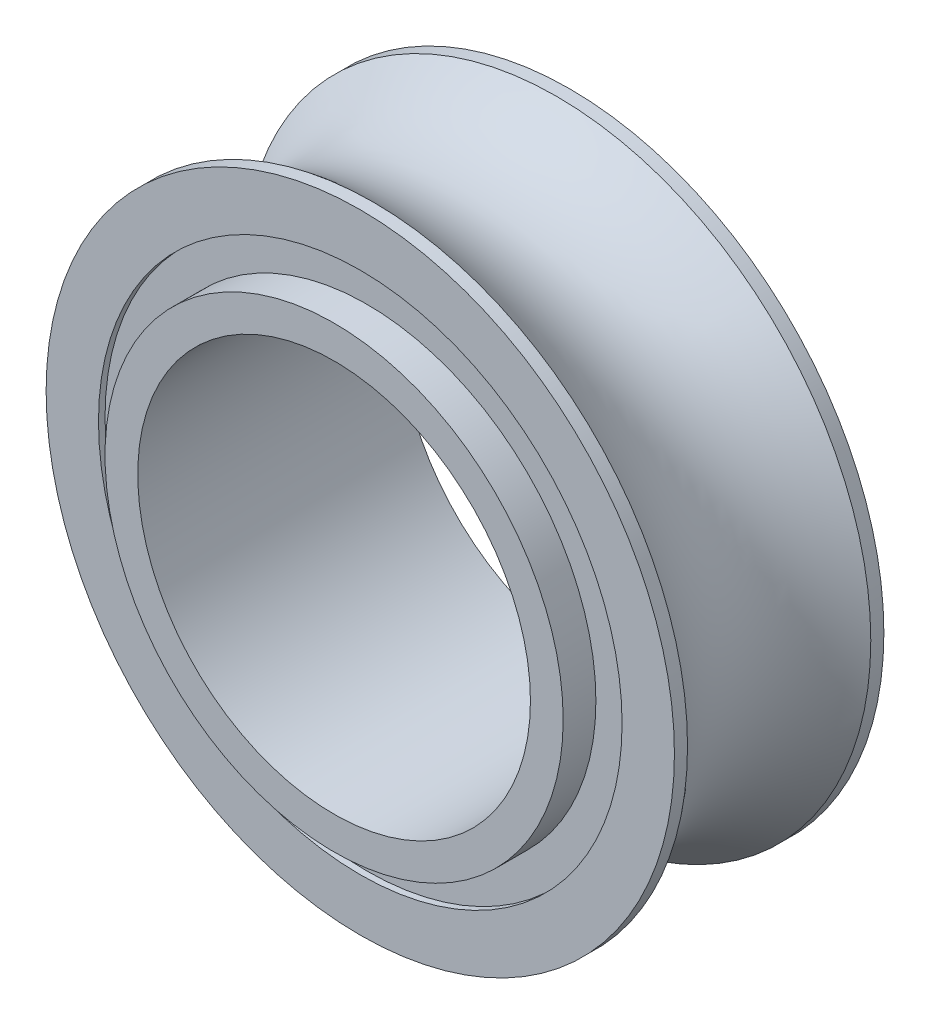
ISO-10303-21;
HEADER;
FILE_DESCRIPTION(('STEP AP214'),'2;1');
FILE_NAME('part.step','',(''),(''),'','','');
FILE_SCHEMA(('AUTOMOTIVE_DESIGN { 1 0 10303 214 1 1 1 1 }'));
ENDSEC;
DATA;
#1=APPLICATION_CONTEXT('core data for automotive mechanical design processes');
#2=APPLICATION_PROTOCOL_DEFINITION('international standard','automotive_design',2000,#1);
#3=PRODUCT_CONTEXT('',#1,'mechanical');
#4=PRODUCT('Part','Part','',(#3));
#5=PRODUCT_RELATED_PRODUCT_CATEGORY('part','',(#4));
#6=PRODUCT_DEFINITION_FORMATION('','',#4);
#7=PRODUCT_DEFINITION_CONTEXT('part definition',#1,'design');
#8=PRODUCT_DEFINITION('design','',#6,#7);
#9=PRODUCT_DEFINITION_SHAPE('','',#8);
#10=(LENGTH_UNIT() NAMED_UNIT(*) SI_UNIT(.MILLI.,.METRE.));
#11=(NAMED_UNIT(*) PLANE_ANGLE_UNIT() SI_UNIT($,.RADIAN.));
#12=(NAMED_UNIT(*) SI_UNIT($,.STERADIAN.) SOLID_ANGLE_UNIT());
#13=UNCERTAINTY_MEASURE_WITH_UNIT(LENGTH_MEASURE(1.E-05),#10,'distance_accuracy_value','');
#14=(GEOMETRIC_REPRESENTATION_CONTEXT(3) GLOBAL_UNCERTAINTY_ASSIGNED_CONTEXT((#13)) GLOBAL_UNIT_ASSIGNED_CONTEXT((#10,
#11,#12)) REPRESENTATION_CONTEXT('',''));
#15=CARTESIAN_POINT('',(0.,0.,0.));
#16=DIRECTION('',(0.,0.,1.));
#17=DIRECTION('',(1.,0.,0.));
#18=AXIS2_PLACEMENT_3D('',#15,#16,#17);
#19=CARTESIAN_POINT('',(0.,0.,10.16));
#20=DIRECTION('',(0.,0.,-1.));
#21=DIRECTION('',(-1.,0.,0.));
#22=AXIS2_PLACEMENT_3D('',#19,#20,#21);
#23=CYLINDRICAL_SURFACE('',#22,30.48);
#24=CARTESIAN_POINT('',(0.,0.,10.16));
#25=DIRECTION('',(0.,0.,1.));
#26=DIRECTION('',(1.,0.,0.));
#27=AXIS2_PLACEMENT_3D('',#24,#25,#26);
#28=CIRCLE('',#27,30.48);
#29=CARTESIAN_POINT('',(30.48,0.,10.16));
#30=VERTEX_POINT('',#29);
#31=EDGE_CURVE('E70',#30,#30,#28,.T.);
#32=ORIENTED_EDGE('',*,*,#31,.F.);
#33=EDGE_LOOP('',(#32));
#34=FACE_BOUND('',#33,.T.);
#35=CARTESIAN_POINT('',(0.,0.,8.89));
#36=DIRECTION('',(0.,0.,1.));
#37=DIRECTION('',(1.,0.,0.));
#38=AXIS2_PLACEMENT_3D('',#35,#36,#37);
#39=CIRCLE('',#38,30.48);
#40=CARTESIAN_POINT('',(30.48,0.,8.89));
#41=VERTEX_POINT('',#40);
#42=EDGE_CURVE('E80',#41,#41,#39,.T.);
#43=ORIENTED_EDGE('',*,*,#42,.T.);
#44=EDGE_LOOP('',(#43));
#45=FACE_BOUND('',#44,.T.);
#46=ADVANCED_FACE('F38',(#34,#45),#23,.T.);
#47=CARTESIAN_POINT('',(0.,0.,-10.16));
#48=DIRECTION('',(0.,0.,1.));
#49=DIRECTION('',(1.,0.,0.));
#50=AXIS2_PLACEMENT_3D('',#47,#48,#49);
#51=CIRCLE('',#50,30.48);
#52=CARTESIAN_POINT('',(30.48,0.,-10.16));
#53=VERTEX_POINT('',#52);
#54=EDGE_CURVE('E71',#53,#53,#51,.T.);
#55=ORIENTED_EDGE('',*,*,#54,.T.);
#56=EDGE_LOOP('',(#55));
#57=FACE_BOUND('',#56,.T.);
#58=CARTESIAN_POINT('',(0.,0.,-8.89));
#59=DIRECTION('',(0.,0.,1.));
#60=DIRECTION('',(1.,0.,0.));
#61=AXIS2_PLACEMENT_3D('',#58,#59,#60);
#62=CIRCLE('',#61,30.48);
#63=CARTESIAN_POINT('',(30.48,0.,-8.89));
#64=VERTEX_POINT('',#63);
#65=EDGE_CURVE('E85',#64,#64,#62,.T.);
#66=ORIENTED_EDGE('',*,*,#65,.F.);
#67=EDGE_LOOP('',(#66));
#68=FACE_BOUND('',#67,.T.);
#69=ADVANCED_FACE('F114',(#57,#68),#23,.T.);
#70=CARTESIAN_POINT('',(0.,0.,12.7));
#71=DIRECTION('',(0.,0.,-1.));
#72=DIRECTION('',(-1.,0.,0.));
#73=AXIS2_PLACEMENT_3D('',#70,#71,#72);
#74=CYLINDRICAL_SURFACE('',#73,22.225);
#75=CARTESIAN_POINT('',(0.,0.,-12.7));
#76=DIRECTION('',(0.,0.,1.));
#77=DIRECTION('',(1.,0.,0.));
#78=AXIS2_PLACEMENT_3D('',#75,#76,#77);
#79=CIRCLE('',#78,22.225);
#80=CARTESIAN_POINT('',(22.225,0.,-12.7));
#81=VERTEX_POINT('',#80);
#82=EDGE_CURVE('E49',#81,#81,#79,.T.);
#83=ORIENTED_EDGE('',*,*,#82,.T.);
#84=EDGE_LOOP('',(#83));
#85=FACE_BOUND('',#84,.T.);
#86=CARTESIAN_POINT('',(0.,0.,-9.525));
#87=DIRECTION('',(0.,0.,1.));
#88=DIRECTION('',(1.,0.,0.));
#89=AXIS2_PLACEMENT_3D('',#86,#87,#88);
#90=CIRCLE('',#89,22.225);
#91=CARTESIAN_POINT('',(22.225,0.,-9.525));
#92=VERTEX_POINT('',#91);
#93=EDGE_CURVE('E10',#92,#92,#90,.T.);
#94=ORIENTED_EDGE('',*,*,#93,.F.);
#95=EDGE_LOOP('',(#94));
#96=FACE_BOUND('',#95,.T.);
#97=ADVANCED_FACE('F131',(#85,#96),#74,.T.);
#98=CARTESIAN_POINT('',(0.,0.,12.7));
#99=DIRECTION('',(0.,0.,1.));
#100=DIRECTION('',(1.,0.,0.));
#101=AXIS2_PLACEMENT_3D('',#98,#99,#100);
#102=PLANE('',#101);
#103=CARTESIAN_POINT('',(0.,0.,12.7));
#104=DIRECTION('',(0.,0.,1.));
#105=DIRECTION('',(1.,0.,0.));
#106=AXIS2_PLACEMENT_3D('',#103,#104,#105);
#107=CIRCLE('',#106,22.225);
#108=CARTESIAN_POINT('',(22.225,0.,12.7));
#109=VERTEX_POINT('',#108);
#110=EDGE_CURVE('E45',#109,#109,#107,.T.);
#111=ORIENTED_EDGE('',*,*,#110,.T.);
#112=EDGE_LOOP('',(#111));
#113=FACE_BOUND('',#112,.T.);
#114=CARTESIAN_POINT('',(0.,0.,12.7));
#115=DIRECTION('',(0.,0.,1.));
#116=DIRECTION('',(1.,0.,0.));
#117=AXIS2_PLACEMENT_3D('',#114,#115,#116);
#118=CIRCLE('',#117,19.05);
#119=CARTESIAN_POINT('',(19.05,0.,12.7));
#120=VERTEX_POINT('',#119);
#121=EDGE_CURVE('E54',#120,#120,#118,.T.);
#122=ORIENTED_EDGE('',*,*,#121,.F.);
#123=EDGE_LOOP('',(#122));
#124=FACE_BOUND('',#123,.T.);
#125=ADVANCED_FACE('F128',(#113,#124),#102,.T.);
#126=CARTESIAN_POINT('',(0.,0.,-12.7));
#127=DIRECTION('',(0.,0.,1.));
#128=DIRECTION('',(1.,0.,0.));
#129=AXIS2_PLACEMENT_3D('',#126,#127,#128);
#130=PLANE('',#129);
#131=ORIENTED_EDGE('',*,*,#82,.F.);
#132=EDGE_LOOP('',(#131));
#133=FACE_BOUND('',#132,.T.);
#134=CARTESIAN_POINT('',(0.,0.,-12.7));
#135=DIRECTION('',(0.,0.,1.));
#136=DIRECTION('',(1.,0.,0.));
#137=AXIS2_PLACEMENT_3D('',#134,#135,#136);
#138=CIRCLE('',#137,19.05);
#139=CARTESIAN_POINT('',(19.05,0.,-12.7));
#140=VERTEX_POINT('',#139);
#141=EDGE_CURVE('E56',#140,#140,#138,.T.);
#142=ORIENTED_EDGE('',*,*,#141,.T.);
#143=EDGE_LOOP('',(#142));
#144=FACE_BOUND('',#143,.T.);
#145=ADVANCED_FACE('F130',(#133,#144),#130,.F.);
#146=CARTESIAN_POINT('',(0.,0.,9.525));
#147=DIRECTION('',(0.,0.,1.));
#148=DIRECTION('',(1.,0.,0.));
#149=AXIS2_PLACEMENT_3D('',#146,#147,#148);
#150=CIRCLE('',#149,22.225);
#151=CARTESIAN_POINT('',(22.225,0.,9.525));
#152=VERTEX_POINT('',#151);
#153=EDGE_CURVE('E64',#152,#152,#150,.T.);
#154=ORIENTED_EDGE('',*,*,#153,.T.);
#155=EDGE_LOOP('',(#154));
#156=FACE_BOUND('',#155,.T.);
#157=ORIENTED_EDGE('',*,*,#110,.F.);
#158=EDGE_LOOP('',(#157));
#159=FACE_BOUND('',#158,.T.);
#160=ADVANCED_FACE('F40',(#156,#159),#74,.T.);
#161=CARTESIAN_POINT('',(0.,0.,12.7));
#162=DIRECTION('',(0.,0.,-1.));
#163=DIRECTION('',(-1.,0.,0.));
#164=AXIS2_PLACEMENT_3D('',#161,#162,#163);
#165=CYLINDRICAL_SURFACE('',#164,19.05);
#166=ORIENTED_EDGE('',*,*,#121,.T.);
#167=EDGE_LOOP('',(#166));
#168=FACE_BOUND('',#167,.T.);
#169=ORIENTED_EDGE('',*,*,#141,.F.);
#170=EDGE_LOOP('',(#169));
#171=FACE_BOUND('',#170,.T.);
#172=ADVANCED_FACE('F120',(#168,#171),#165,.F.);
#173=CARTESIAN_POINT('',(0.,0.,9.525));
#174=DIRECTION('',(0.,0.,1.));
#175=DIRECTION('',(1.,0.,0.));
#176=AXIS2_PLACEMENT_3D('',#173,#174,#175);
#177=PLANE('',#176);
#178=CARTESIAN_POINT('',(0.,0.,9.525));
#179=DIRECTION('',(0.,0.,1.));
#180=DIRECTION('',(1.,0.,0.));
#181=AXIS2_PLACEMENT_3D('',#178,#179,#180);
#182=CIRCLE('',#181,25.4);
#183=CARTESIAN_POINT('',(25.4,0.,9.525));
#184=VERTEX_POINT('',#183);
#185=EDGE_CURVE('E67',#184,#184,#182,.F.);
#186=ORIENTED_EDGE('',*,*,#185,.F.);
#187=EDGE_LOOP('',(#186));
#188=FACE_BOUND('',#187,.T.);
#189=ORIENTED_EDGE('',*,*,#153,.F.);
#190=EDGE_LOOP('',(#189));
#191=FACE_BOUND('',#190,.T.);
#192=ADVANCED_FACE('F116',(#188,#191),#177,.T.);
#193=CARTESIAN_POINT('',(0.,0.,-9.525));
#194=DIRECTION('',(0.,0.,1.));
#195=DIRECTION('',(1.,0.,0.));
#196=AXIS2_PLACEMENT_3D('',#193,#194,#195);
#197=PLANE('',#196);
#198=CARTESIAN_POINT('',(0.,0.,-9.525));
#199=DIRECTION('',(0.,0.,1.));
#200=DIRECTION('',(1.,0.,0.));
#201=AXIS2_PLACEMENT_3D('',#198,#199,#200);
#202=CIRCLE('',#201,25.4);
#203=CARTESIAN_POINT('',(25.4,0.,-9.525));
#204=VERTEX_POINT('',#203);
#205=EDGE_CURVE('E59',#204,#204,#202,.T.);
#206=ORIENTED_EDGE('',*,*,#205,.F.);
#207=EDGE_LOOP('',(#206));
#208=FACE_BOUND('',#207,.T.);
#209=ORIENTED_EDGE('',*,*,#93,.T.);
#210=EDGE_LOOP('',(#209));
#211=FACE_BOUND('',#210,.T.);
#212=ADVANCED_FACE('F119',(#208,#211),#197,.F.);
#213=CARTESIAN_POINT('',(0.,0.,10.16));
#214=DIRECTION('',(0.,0.,-1.));
#215=DIRECTION('',(-1.,0.,0.));
#216=AXIS2_PLACEMENT_3D('',#213,#214,#215);
#217=CYLINDRICAL_SURFACE('',#216,25.4);
#218=CARTESIAN_POINT('',(0.,0.,-10.16));
#219=DIRECTION('',(0.,0.,1.));
#220=DIRECTION('',(1.,0.,0.));
#221=AXIS2_PLACEMENT_3D('',#218,#219,#220);
#222=CIRCLE('',#221,25.4);
#223=CARTESIAN_POINT('',(25.4,0.,-10.16));
#224=VERTEX_POINT('',#223);
#225=EDGE_CURVE('E77',#224,#224,#222,.T.);
#226=ORIENTED_EDGE('',*,*,#225,.F.);
#227=EDGE_LOOP('',(#226));
#228=FACE_BOUND('',#227,.T.);
#229=ORIENTED_EDGE('',*,*,#205,.T.);
#230=EDGE_LOOP('',(#229));
#231=FACE_BOUND('',#230,.T.);
#232=ADVANCED_FACE('F104',(#228,#231),#217,.F.);
#233=CARTESIAN_POINT('',(0.,0.,10.16));
#234=DIRECTION('',(0.,0.,1.));
#235=DIRECTION('',(1.,0.,0.));
#236=AXIS2_PLACEMENT_3D('',#233,#234,#235);
#237=PLANE('',#236);
#238=ORIENTED_EDGE('',*,*,#31,.T.);
#239=EDGE_LOOP('',(#238));
#240=FACE_BOUND('',#239,.T.);
#241=CARTESIAN_POINT('',(0.,0.,10.16));
#242=DIRECTION('',(0.,0.,1.));
#243=DIRECTION('',(1.,0.,0.));
#244=AXIS2_PLACEMENT_3D('',#241,#242,#243);
#245=CIRCLE('',#244,25.4);
#246=CARTESIAN_POINT('',(25.4,0.,10.16));
#247=VERTEX_POINT('',#246);
#248=EDGE_CURVE('E74',#247,#247,#245,.T.);
#249=ORIENTED_EDGE('',*,*,#248,.F.);
#250=EDGE_LOOP('',(#249));
#251=FACE_BOUND('',#250,.T.);
#252=ADVANCED_FACE('F105',(#240,#251),#237,.T.);
#253=CARTESIAN_POINT('',(0.,0.,-10.16));
#254=DIRECTION('',(0.,0.,1.));
#255=DIRECTION('',(1.,0.,0.));
#256=AXIS2_PLACEMENT_3D('',#253,#254,#255);
#257=PLANE('',#256);
#258=ORIENTED_EDGE('',*,*,#54,.F.);
#259=EDGE_LOOP('',(#258));
#260=FACE_BOUND('',#259,.T.);
#261=ORIENTED_EDGE('',*,*,#225,.T.);
#262=EDGE_LOOP('',(#261));
#263=FACE_BOUND('',#262,.T.);
#264=ADVANCED_FACE('F102',(#260,#263),#257,.F.);
#265=ORIENTED_EDGE('',*,*,#185,.T.);
#266=EDGE_LOOP('',(#265));
#267=FACE_BOUND('',#266,.T.);
#268=ORIENTED_EDGE('',*,*,#248,.T.);
#269=EDGE_LOOP('',(#268));
#270=FACE_BOUND('',#269,.T.);
#271=ADVANCED_FACE('F98',(#267,#270),#217,.F.);
#272=CARTESIAN_POINT('',(0.,30.48,8.89));
#273=CARTESIAN_POINT('',(0.,22.86,0.));
#274=CARTESIAN_POINT('',(0.,30.48,-8.89));
#275=B_SPLINE_CURVE_WITH_KNOTS('',2,(#272,#273,#274),.UNSPECIFIED.,.F.,.F.,(3,3),(0.,1.),.UNSPECIFIED.);
#276=CARTESIAN_POINT('',(0.,0.,0.));
#277=DIRECTION('',(0.,0.,1.));
#278=AXIS1_PLACEMENT('',#276,#277);
#279=SURFACE_OF_REVOLUTION('',#275,#278);
#280=ORIENTED_EDGE('',*,*,#65,.T.);
#281=EDGE_LOOP('',(#280));
#282=FACE_BOUND('',#281,.T.);
#283=ORIENTED_EDGE('',*,*,#42,.F.);
#284=EDGE_LOOP('',(#283));
#285=FACE_BOUND('',#284,.T.);
#286=ADVANCED_FACE('F95',(#282,#285),#279,.F.);
#287=CLOSED_SHELL('',(#46,#69,#97,#125,#145,#160,#172,#192,#212,#232,#252,#264,#271,#286));
#288=MANIFOLD_SOLID_BREP('B2',#287);
#289=ADVANCED_BREP_SHAPE_REPRESENTATION('',(#18,#288),#14);
#290=SHAPE_DEFINITION_REPRESENTATION(#9,#289);
ENDSEC;
END-ISO-10303-21;
